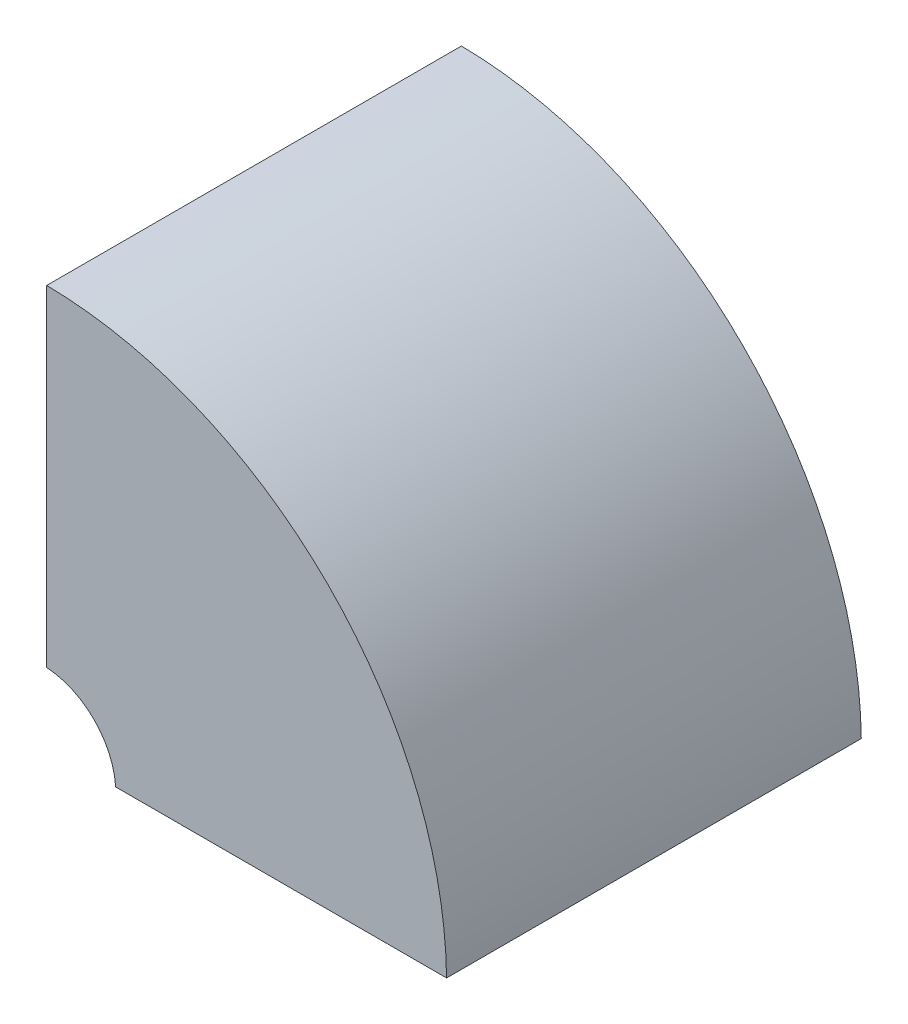
ISO-10303-21;
HEADER;
FILE_DESCRIPTION(('STEP AP214'),'2;1');
FILE_NAME('part.step','',(''),(''),'','','');
FILE_SCHEMA(('AUTOMOTIVE_DESIGN { 1 0 10303 214 1 1 1 1 }'));
ENDSEC;
DATA;
#1=APPLICATION_CONTEXT('core data for automotive mechanical design processes');
#2=APPLICATION_PROTOCOL_DEFINITION('international standard','automotive_design',2000,#1);
#3=PRODUCT_CONTEXT('',#1,'mechanical');
#4=PRODUCT('Part','Part','',(#3));
#5=PRODUCT_RELATED_PRODUCT_CATEGORY('part','',(#4));
#6=PRODUCT_DEFINITION_FORMATION('','',#4);
#7=PRODUCT_DEFINITION_CONTEXT('part definition',#1,'design');
#8=PRODUCT_DEFINITION('design','',#6,#7);
#9=PRODUCT_DEFINITION_SHAPE('','',#8);
#10=(LENGTH_UNIT() NAMED_UNIT(*) SI_UNIT(.MILLI.,.METRE.));
#11=(NAMED_UNIT(*) PLANE_ANGLE_UNIT() SI_UNIT($,.RADIAN.));
#12=(NAMED_UNIT(*) SI_UNIT($,.STERADIAN.) SOLID_ANGLE_UNIT());
#13=UNCERTAINTY_MEASURE_WITH_UNIT(LENGTH_MEASURE(1.E-05),#10,'distance_accuracy_value','');
#14=(GEOMETRIC_REPRESENTATION_CONTEXT(3) GLOBAL_UNCERTAINTY_ASSIGNED_CONTEXT((#13)) GLOBAL_UNIT_ASSIGNED_CONTEXT((#10,
#11,#12)) REPRESENTATION_CONTEXT('',''));
#15=CARTESIAN_POINT('',(0.,0.,0.));
#16=DIRECTION('',(0.,0.,1.));
#17=DIRECTION('',(1.,0.,0.));
#18=AXIS2_PLACEMENT_3D('',#15,#16,#17);
#19=CARTESIAN_POINT('',(0.,0.,-42.));
#20=DIRECTION('',(0.,0.,1.));
#21=DIRECTION('',(1.,0.,0.));
#22=AXIS2_PLACEMENT_3D('',#19,#20,#21);
#23=CYLINDRICAL_SURFACE('',#22,41.);
#24=CARTESIAN_POINT('',(0.,0.,0.));
#25=DIRECTION('',(0.,0.,1.));
#26=DIRECTION('',(1.,0.,0.));
#27=AXIS2_PLACEMENT_3D('',#24,#25,#26);
#28=CIRCLE('',#27,41.);
#29=CARTESIAN_POINT('',(40.9969511061494,0.500000000000029,0.));
#30=VERTEX_POINT('',#29);
#31=CARTESIAN_POINT('',(0.499999999999968,40.9969511061494,0.));
#32=VERTEX_POINT('',#31);
#33=EDGE_CURVE('E111',#30,#32,#28,.T.);
#34=ORIENTED_EDGE('',*,*,#33,.F.);
#35=DIRECTION('',(0.,0.,1.));
#36=VECTOR('',#35,1.);
#37=CARTESIAN_POINT('',(40.9969511061494,0.500000000000029,-42.));
#38=LINE('',#37,#36);
#39=CARTESIAN_POINT('',(40.9969511061494,0.500000000000029,-42.));
#40=VERTEX_POINT('',#39);
#41=EDGE_CURVE('E11',#40,#30,#38,.T.);
#42=ORIENTED_EDGE('',*,*,#41,.F.);
#43=CARTESIAN_POINT('',(0.,0.,-42.));
#44=DIRECTION('',(0.,0.,1.));
#45=DIRECTION('',(1.,0.,0.));
#46=AXIS2_PLACEMENT_3D('',#43,#44,#45);
#47=CIRCLE('',#46,41.);
#48=CARTESIAN_POINT('',(0.499999999999968,40.9969511061494,-42.));
#49=VERTEX_POINT('',#48);
#50=EDGE_CURVE('E103',#40,#49,#47,.T.);
#51=ORIENTED_EDGE('',*,*,#50,.T.);
#52=DIRECTION('',(0.,0.,1.));
#53=VECTOR('',#52,1.);
#54=CARTESIAN_POINT('',(0.499999999999968,40.9969511061494,-42.));
#55=LINE('',#54,#53);
#56=EDGE_CURVE('E44',#49,#32,#55,.T.);
#57=ORIENTED_EDGE('',*,*,#56,.T.);
#58=EDGE_LOOP('',(#34,#42,#51,#57));
#59=FACE_BOUND('',#58,.T.);
#60=ADVANCED_FACE('F41',(#59),#23,.T.);
#61=CARTESIAN_POINT('',(7.48331477354788,0.500000000000028,-42.));
#62=DIRECTION('',(0.,-1.,0.));
#63=DIRECTION('',(1.,0.,0.));
#64=AXIS2_PLACEMENT_3D('',#61,#62,#63);
#65=PLANE('',#64);
#66=DIRECTION('',(1.,0.,0.));
#67=VECTOR('',#66,1.);
#68=CARTESIAN_POINT('',(7.48331477354788,0.500000000000028,0.));
#69=LINE('',#68,#67);
#70=CARTESIAN_POINT('',(7.48331477354788,0.500000000000028,0.));
#71=VERTEX_POINT('',#70);
#72=EDGE_CURVE('E106',#71,#30,#69,.T.);
#73=ORIENTED_EDGE('',*,*,#72,.F.);
#74=DIRECTION('',(0.,0.,1.));
#75=VECTOR('',#74,1.);
#76=CARTESIAN_POINT('',(7.48331477354788,0.500000000000028,-42.));
#77=LINE('',#76,#75);
#78=CARTESIAN_POINT('',(7.48331477354788,0.500000000000028,-42.));
#79=VERTEX_POINT('',#78);
#80=EDGE_CURVE('E51',#79,#71,#77,.T.);
#81=ORIENTED_EDGE('',*,*,#80,.F.);
#82=DIRECTION('',(1.,0.,0.));
#83=VECTOR('',#82,1.);
#84=CARTESIAN_POINT('',(7.48331477354788,0.500000000000028,-42.));
#85=LINE('',#84,#83);
#86=EDGE_CURVE('E98',#79,#40,#85,.T.);
#87=ORIENTED_EDGE('',*,*,#86,.T.);
#88=ORIENTED_EDGE('',*,*,#41,.T.);
#89=EDGE_LOOP('',(#73,#81,#87,#88));
#90=FACE_BOUND('',#89,.T.);
#91=ADVANCED_FACE('F127',(#90),#65,.T.);
#92=CARTESIAN_POINT('',(0.,0.,-42.));
#93=DIRECTION('',(0.,0.,1.));
#94=DIRECTION('',(1.,0.,0.));
#95=AXIS2_PLACEMENT_3D('',#92,#93,#94);
#96=CYLINDRICAL_SURFACE('',#95,7.5);
#97=CARTESIAN_POINT('',(0.,0.,0.));
#98=DIRECTION('',(0.,0.,-1.));
#99=DIRECTION('',(1.,0.,0.));
#100=AXIS2_PLACEMENT_3D('',#97,#98,#99);
#101=CIRCLE('',#100,7.5);
#102=CARTESIAN_POINT('',(0.499999999999973,7.48331477354788,0.));
#103=VERTEX_POINT('',#102);
#104=EDGE_CURVE('E92',#103,#71,#101,.T.);
#105=ORIENTED_EDGE('',*,*,#104,.F.);
#106=DIRECTION('',(0.,0.,1.));
#107=VECTOR('',#106,1.);
#108=CARTESIAN_POINT('',(0.499999999999973,7.48331477354788,-42.));
#109=LINE('',#108,#107);
#110=CARTESIAN_POINT('',(0.499999999999973,7.48331477354788,-42.));
#111=VERTEX_POINT('',#110);
#112=EDGE_CURVE('E87',#111,#103,#109,.T.);
#113=ORIENTED_EDGE('',*,*,#112,.F.);
#114=CARTESIAN_POINT('',(0.,0.,-42.));
#115=DIRECTION('',(0.,0.,-1.));
#116=DIRECTION('',(1.,0.,0.));
#117=AXIS2_PLACEMENT_3D('',#114,#115,#116);
#118=CIRCLE('',#117,7.5);
#119=EDGE_CURVE('E90',#111,#79,#118,.T.);
#120=ORIENTED_EDGE('',*,*,#119,.T.);
#121=ORIENTED_EDGE('',*,*,#80,.T.);
#122=EDGE_LOOP('',(#105,#113,#120,#121));
#123=FACE_BOUND('',#122,.T.);
#124=ADVANCED_FACE('F89',(#123),#96,.F.);
#125=CARTESIAN_POINT('',(0.499999999999968,40.9969511061494,-42.));
#126=DIRECTION('',(-1.,0.,0.));
#127=DIRECTION('',(0.,-1.,0.));
#128=AXIS2_PLACEMENT_3D('',#125,#126,#127);
#129=PLANE('',#128);
#130=DIRECTION('',(0.,-1.,0.));
#131=VECTOR('',#130,1.);
#132=CARTESIAN_POINT('',(0.499999999999968,40.9969511061494,0.));
#133=LINE('',#132,#131);
#134=EDGE_CURVE('E115',#32,#103,#133,.T.);
#135=ORIENTED_EDGE('',*,*,#134,.F.);
#136=ORIENTED_EDGE('',*,*,#56,.F.);
#137=DIRECTION('',(0.,-1.,0.));
#138=VECTOR('',#137,1.);
#139=CARTESIAN_POINT('',(0.499999999999968,40.9969511061494,-42.));
#140=LINE('',#139,#138);
#141=EDGE_CURVE('E97',#49,#111,#140,.T.);
#142=ORIENTED_EDGE('',*,*,#141,.T.);
#143=ORIENTED_EDGE('',*,*,#112,.T.);
#144=EDGE_LOOP('',(#135,#136,#142,#143));
#145=FACE_BOUND('',#144,.T.);
#146=ADVANCED_FACE('F101',(#145),#129,.T.);
#147=CARTESIAN_POINT('',(0.,0.,-42.));
#148=DIRECTION('',(0.,0.,1.));
#149=DIRECTION('',(1.,0.,0.));
#150=AXIS2_PLACEMENT_3D('',#147,#148,#149);
#151=PLANE('',#150);
#152=ORIENTED_EDGE('',*,*,#50,.F.);
#153=ORIENTED_EDGE('',*,*,#86,.F.);
#154=ORIENTED_EDGE('',*,*,#119,.F.);
#155=ORIENTED_EDGE('',*,*,#141,.F.);
#156=EDGE_LOOP('',(#152,#153,#154,#155));
#157=FACE_BOUND('',#156,.T.);
#158=ADVANCED_FACE('F96',(#157),#151,.F.);
#159=CARTESIAN_POINT('',(0.,0.,0.));
#160=DIRECTION('',(0.,0.,1.));
#161=DIRECTION('',(1.,0.,0.));
#162=AXIS2_PLACEMENT_3D('',#159,#160,#161);
#163=PLANE('',#162);
#164=ORIENTED_EDGE('',*,*,#33,.T.);
#165=ORIENTED_EDGE('',*,*,#134,.T.);
#166=ORIENTED_EDGE('',*,*,#104,.T.);
#167=ORIENTED_EDGE('',*,*,#72,.T.);
#168=EDGE_LOOP('',(#164,#165,#166,#167));
#169=FACE_BOUND('',#168,.T.);
#170=ADVANCED_FACE('F126',(#169),#163,.T.);
#171=CLOSED_SHELL('',(#60,#91,#124,#146,#158,#170));
#172=MANIFOLD_SOLID_BREP('B2',#171);
#173=ADVANCED_BREP_SHAPE_REPRESENTATION('',(#18,#172),#14);
#174=SHAPE_DEFINITION_REPRESENTATION(#9,#173);
ENDSEC;
END-ISO-10303-21;
